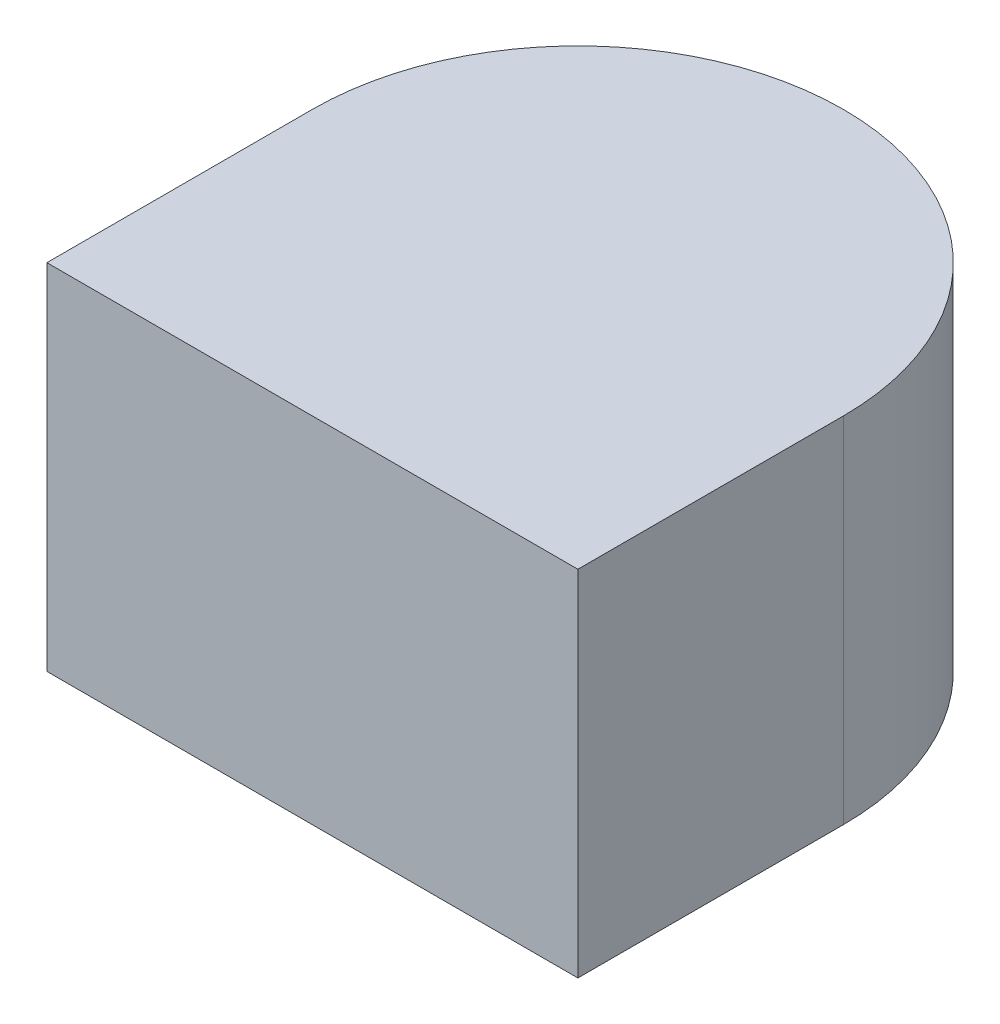
ISO-10303-21;
HEADER;
FILE_DESCRIPTION(('STEP AP214'),'2;1');
FILE_NAME('part.step','',(''),(''),'','','');
FILE_SCHEMA(('AUTOMOTIVE_DESIGN { 1 0 10303 214 1 1 1 1 }'));
ENDSEC;
DATA;
#1=APPLICATION_CONTEXT('core data for automotive mechanical design processes');
#2=APPLICATION_PROTOCOL_DEFINITION('international standard','automotive_design',2000,#1);
#3=PRODUCT_CONTEXT('',#1,'mechanical');
#4=PRODUCT('Part','Part','',(#3));
#5=PRODUCT_RELATED_PRODUCT_CATEGORY('part','',(#4));
#6=PRODUCT_DEFINITION_FORMATION('','',#4);
#7=PRODUCT_DEFINITION_CONTEXT('part definition',#1,'design');
#8=PRODUCT_DEFINITION('design','',#6,#7);
#9=PRODUCT_DEFINITION_SHAPE('','',#8);
#10=(LENGTH_UNIT() NAMED_UNIT(*) SI_UNIT(.MILLI.,.METRE.));
#11=(NAMED_UNIT(*) PLANE_ANGLE_UNIT() SI_UNIT($,.RADIAN.));
#12=(NAMED_UNIT(*) SI_UNIT($,.STERADIAN.) SOLID_ANGLE_UNIT());
#13=UNCERTAINTY_MEASURE_WITH_UNIT(LENGTH_MEASURE(1.E-05),#10,'distance_accuracy_value','');
#14=(GEOMETRIC_REPRESENTATION_CONTEXT(3) GLOBAL_UNCERTAINTY_ASSIGNED_CONTEXT((#13)) GLOBAL_UNIT_ASSIGNED_CONTEXT((#10,
#11,#12)) REPRESENTATION_CONTEXT('',''));
#15=CARTESIAN_POINT('',(0.,0.,0.));
#16=DIRECTION('',(0.,0.,1.));
#17=DIRECTION('',(1.,0.,0.));
#18=AXIS2_PLACEMENT_3D('',#15,#16,#17);
#19=CARTESIAN_POINT('',(6.4262,3.1756,-0.927999999999993));
#20=DIRECTION('',(0.,-1.,0.));
#21=DIRECTION('',(0.,0.,-1.));
#22=AXIS2_PLACEMENT_3D('',#19,#20,#21);
#23=CYLINDRICAL_SURFACE('',#22,0.15);
#24=CARTESIAN_POINT('',(6.4262,3.1756,-0.927999999999993));
#25=DIRECTION('',(0.,1.,0.));
#26=DIRECTION('',(0.,0.,-1.));
#27=AXIS2_PLACEMENT_3D('',#24,#25,#26);
#28=CIRCLE('',#27,0.15);
#29=CARTESIAN_POINT('',(6.4262,3.1756,-1.078));
#30=VERTEX_POINT('',#29);
#31=CARTESIAN_POINT('',(6.2762,3.1756,-0.927999999999993));
#32=VERTEX_POINT('',#31);
#33=EDGE_CURVE('E11',#30,#32,#28,.T.);
#34=ORIENTED_EDGE('',*,*,#33,.F.);
#35=DIRECTION('',(0.,-1.,0.));
#36=VECTOR('',#35,1.);
#37=CARTESIAN_POINT('',(6.4262,3.1756,-1.078));
#38=LINE('',#37,#36);
#39=CARTESIAN_POINT('',(6.4262,2.9756,-1.078));
#40=VERTEX_POINT('',#39);
#41=EDGE_CURVE('E24',#30,#40,#38,.T.);
#42=ORIENTED_EDGE('',*,*,#41,.T.);
#43=CARTESIAN_POINT('',(6.4262,2.9756,-0.927999999999993));
#44=DIRECTION('',(0.,1.,0.));
#45=DIRECTION('',(0.,0.,-1.));
#46=AXIS2_PLACEMENT_3D('',#43,#44,#45);
#47=CIRCLE('',#46,0.15);
#48=CARTESIAN_POINT('',(6.2762,2.9756,-0.927999999999993));
#49=VERTEX_POINT('',#48);
#50=EDGE_CURVE('E100',#40,#49,#47,.T.);
#51=ORIENTED_EDGE('',*,*,#50,.T.);
#52=DIRECTION('',(0.,-1.,0.));
#53=VECTOR('',#52,1.);
#54=CARTESIAN_POINT('',(6.2762,3.1756,-0.927999999999993));
#55=LINE('',#54,#53);
#56=EDGE_CURVE('E97',#32,#49,#55,.T.);
#57=ORIENTED_EDGE('',*,*,#56,.F.);
#58=EDGE_LOOP('',(#34,#42,#51,#57));
#59=FACE_BOUND('',#58,.T.);
#60=ADVANCED_FACE('F17',(#59),#23,.T.);
#61=CARTESIAN_POINT('',(6.4262,3.1756,-0.927999999999993));
#62=DIRECTION('',(0.,-1.,0.));
#63=DIRECTION('',(0.,0.,-1.));
#64=AXIS2_PLACEMENT_3D('',#61,#62,#63);
#65=CYLINDRICAL_SURFACE('',#64,0.15);
#66=ORIENTED_EDGE('',*,*,#41,.F.);
#67=CARTESIAN_POINT('',(6.4262,3.1756,-0.927999999999993));
#68=DIRECTION('',(0.,1.,0.));
#69=DIRECTION('',(0.,0.,-1.));
#70=AXIS2_PLACEMENT_3D('',#67,#68,#69);
#71=CIRCLE('',#70,0.15);
#72=CARTESIAN_POINT('',(6.5762,3.1756,-0.927999999999993));
#73=VERTEX_POINT('',#72);
#74=EDGE_CURVE('E95',#73,#30,#71,.T.);
#75=ORIENTED_EDGE('',*,*,#74,.F.);
#76=DIRECTION('',(0.,-1.,0.));
#77=VECTOR('',#76,1.);
#78=CARTESIAN_POINT('',(6.5762,3.1756,-0.927999999999993));
#79=LINE('',#78,#77);
#80=CARTESIAN_POINT('',(6.5762,2.9756,-0.927999999999993));
#81=VERTEX_POINT('',#80);
#82=EDGE_CURVE('E81',#73,#81,#79,.T.);
#83=ORIENTED_EDGE('',*,*,#82,.T.);
#84=CARTESIAN_POINT('',(6.4262,2.9756,-0.927999999999993));
#85=DIRECTION('',(0.,1.,0.));
#86=DIRECTION('',(0.,0.,-1.));
#87=AXIS2_PLACEMENT_3D('',#84,#85,#86);
#88=CIRCLE('',#87,0.15);
#89=EDGE_CURVE('E91',#81,#40,#88,.T.);
#90=ORIENTED_EDGE('',*,*,#89,.T.);
#91=EDGE_LOOP('',(#66,#75,#83,#90));
#92=FACE_BOUND('',#91,.T.);
#93=ADVANCED_FACE('F107',(#92),#65,.T.);
#94=CARTESIAN_POINT('',(6.2762,3.1756,-0.927999999999993));
#95=DIRECTION('',(1.,0.,0.));
#96=DIRECTION('',(0.,0.,-1.));
#97=AXIS2_PLACEMENT_3D('',#94,#95,#96);
#98=PLANE('',#97);
#99=DIRECTION('',(0.,0.,1.));
#100=VECTOR('',#99,1.);
#101=CARTESIAN_POINT('',(6.2762,2.9756,-0.927999999999993));
#102=LINE('',#101,#100);
#103=CARTESIAN_POINT('',(6.2762,2.9756,-0.777999999999993));
#104=VERTEX_POINT('',#103);
#105=EDGE_CURVE('E89',#49,#104,#102,.T.);
#106=ORIENTED_EDGE('',*,*,#105,.T.);
#107=DIRECTION('',(0.,-1.,0.));
#108=VECTOR('',#107,1.);
#109=CARTESIAN_POINT('',(6.2762,3.1756,-0.777999999999993));
#110=LINE('',#109,#108);
#111=CARTESIAN_POINT('',(6.2762,3.1756,-0.777999999999993));
#112=VERTEX_POINT('',#111);
#113=EDGE_CURVE('E87',#112,#104,#110,.T.);
#114=ORIENTED_EDGE('',*,*,#113,.F.);
#115=DIRECTION('',(0.,0.,1.));
#116=VECTOR('',#115,1.);
#117=CARTESIAN_POINT('',(6.2762,3.1756,-0.927999999999993));
#118=LINE('',#117,#116);
#119=EDGE_CURVE('E76',#32,#112,#118,.T.);
#120=ORIENTED_EDGE('',*,*,#119,.F.);
#121=ORIENTED_EDGE('',*,*,#56,.T.);
#122=EDGE_LOOP('',(#106,#114,#120,#121));
#123=FACE_BOUND('',#122,.T.);
#124=ADVANCED_FACE('F109',(#123),#98,.F.);
#125=CARTESIAN_POINT('',(6.2762,3.1756,-0.777999999999993));
#126=DIRECTION('',(0.,0.,-1.));
#127=DIRECTION('',(-1.,0.,0.));
#128=AXIS2_PLACEMENT_3D('',#125,#126,#127);
#129=PLANE('',#128);
#130=DIRECTION('',(1.,0.,0.));
#131=VECTOR('',#130,1.);
#132=CARTESIAN_POINT('',(6.2762,2.9756,-0.777999999999993));
#133=LINE('',#132,#131);
#134=CARTESIAN_POINT('',(6.5762,2.9756,-0.777999999999993));
#135=VERTEX_POINT('',#134);
#136=EDGE_CURVE('E66',#104,#135,#133,.T.);
#137=ORIENTED_EDGE('',*,*,#136,.T.);
#138=DIRECTION('',(0.,-1.,0.));
#139=VECTOR('',#138,1.);
#140=CARTESIAN_POINT('',(6.5762,3.1756,-0.777999999999993));
#141=LINE('',#140,#139);
#142=CARTESIAN_POINT('',(6.5762,3.1756,-0.777999999999993));
#143=VERTEX_POINT('',#142);
#144=EDGE_CURVE('E60',#143,#135,#141,.T.);
#145=ORIENTED_EDGE('',*,*,#144,.F.);
#146=DIRECTION('',(1.,0.,0.));
#147=VECTOR('',#146,1.);
#148=CARTESIAN_POINT('',(6.2762,3.1756,-0.777999999999993));
#149=LINE('',#148,#147);
#150=EDGE_CURVE('E64',#112,#143,#149,.T.);
#151=ORIENTED_EDGE('',*,*,#150,.F.);
#152=ORIENTED_EDGE('',*,*,#113,.T.);
#153=EDGE_LOOP('',(#137,#145,#151,#152));
#154=FACE_BOUND('',#153,.T.);
#155=ADVANCED_FACE('F62',(#154),#129,.F.);
#156=CARTESIAN_POINT('',(6.5762,3.1756,-0.777999999999993));
#157=DIRECTION('',(-1.,0.,0.));
#158=DIRECTION('',(0.,0.,1.));
#159=AXIS2_PLACEMENT_3D('',#156,#157,#158);
#160=PLANE('',#159);
#161=DIRECTION('',(0.,0.,-1.));
#162=VECTOR('',#161,1.);
#163=CARTESIAN_POINT('',(6.5762,2.9756,-0.777999999999993));
#164=LINE('',#163,#162);
#165=EDGE_CURVE('E77',#135,#81,#164,.T.);
#166=ORIENTED_EDGE('',*,*,#165,.T.);
#167=ORIENTED_EDGE('',*,*,#82,.F.);
#168=DIRECTION('',(0.,0.,-1.));
#169=VECTOR('',#168,1.);
#170=CARTESIAN_POINT('',(6.5762,3.1756,-0.777999999999993));
#171=LINE('',#170,#169);
#172=EDGE_CURVE('E74',#143,#73,#171,.T.);
#173=ORIENTED_EDGE('',*,*,#172,.F.);
#174=ORIENTED_EDGE('',*,*,#144,.T.);
#175=EDGE_LOOP('',(#166,#167,#173,#174));
#176=FACE_BOUND('',#175,.T.);
#177=ADVANCED_FACE('F80',(#176),#160,.F.);
#178=CARTESIAN_POINT('',(6.4262,3.1756,-0.927999999999993));
#179=DIRECTION('',(0.,-1.,0.));
#180=DIRECTION('',(0.,0.,-1.));
#181=AXIS2_PLACEMENT_3D('',#178,#179,#180);
#182=PLANE('',#181);
#183=ORIENTED_EDGE('',*,*,#74,.T.);
#184=ORIENTED_EDGE('',*,*,#33,.T.);
#185=ORIENTED_EDGE('',*,*,#119,.T.);
#186=ORIENTED_EDGE('',*,*,#150,.T.);
#187=ORIENTED_EDGE('',*,*,#172,.T.);
#188=EDGE_LOOP('',(#183,#184,#185,#186,#187));
#189=FACE_BOUND('',#188,.T.);
#190=ADVANCED_FACE('F73',(#189),#182,.F.);
#191=CARTESIAN_POINT('',(6.4262,2.9756,-0.927999999999993));
#192=DIRECTION('',(0.,-1.,0.));
#193=DIRECTION('',(0.,0.,-1.));
#194=AXIS2_PLACEMENT_3D('',#191,#192,#193);
#195=PLANE('',#194);
#196=ORIENTED_EDGE('',*,*,#89,.F.);
#197=ORIENTED_EDGE('',*,*,#165,.F.);
#198=ORIENTED_EDGE('',*,*,#136,.F.);
#199=ORIENTED_EDGE('',*,*,#105,.F.);
#200=ORIENTED_EDGE('',*,*,#50,.F.);
#201=EDGE_LOOP('',(#196,#197,#198,#199,#200));
#202=FACE_BOUND('',#201,.T.);
#203=ADVANCED_FACE('F106',(#202),#195,.T.);
#204=CLOSED_SHELL('',(#60,#93,#124,#155,#177,#190,#203));
#205=MANIFOLD_SOLID_BREP('B1',#204);
#206=ADVANCED_BREP_SHAPE_REPRESENTATION('',(#18,#205),#14);
#207=SHAPE_DEFINITION_REPRESENTATION(#9,#206);
ENDSEC;
END-ISO-10303-21;
